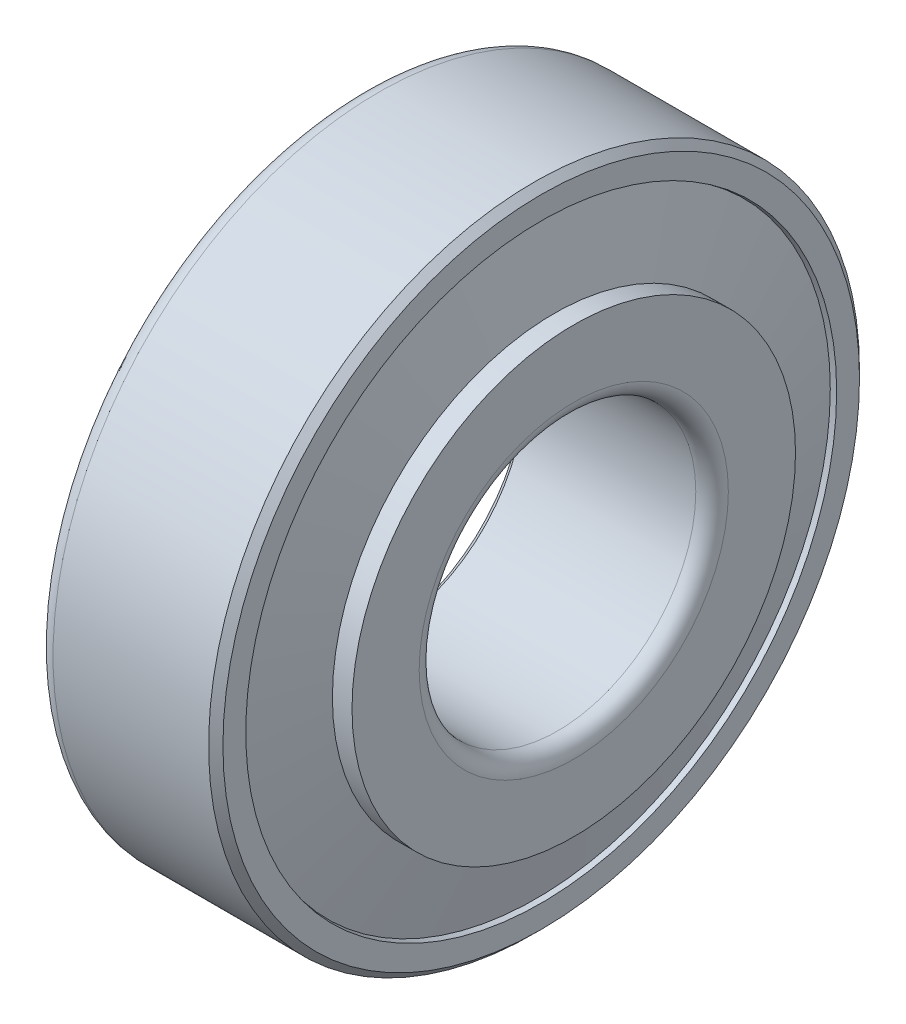
ISO-10303-21;
HEADER;
FILE_DESCRIPTION(('STEP AP214'),'2;1');
FILE_NAME('part.step','',(''),(''),'','','');
FILE_SCHEMA(('AUTOMOTIVE_DESIGN { 1 0 10303 214 1 1 1 1 }'));
ENDSEC;
DATA;
#1=APPLICATION_CONTEXT('core data for automotive mechanical design processes');
#2=APPLICATION_PROTOCOL_DEFINITION('international standard','automotive_design',2000,#1);
#3=PRODUCT_CONTEXT('',#1,'mechanical');
#4=PRODUCT('Part','Part','',(#3));
#5=PRODUCT_RELATED_PRODUCT_CATEGORY('part','',(#4));
#6=PRODUCT_DEFINITION_FORMATION('','',#4);
#7=PRODUCT_DEFINITION_CONTEXT('part definition',#1,'design');
#8=PRODUCT_DEFINITION('design','',#6,#7);
#9=PRODUCT_DEFINITION_SHAPE('','',#8);
#10=(LENGTH_UNIT() NAMED_UNIT(*) SI_UNIT(.MILLI.,.METRE.));
#11=(NAMED_UNIT(*) PLANE_ANGLE_UNIT() SI_UNIT($,.RADIAN.));
#12=(NAMED_UNIT(*) SI_UNIT($,.STERADIAN.) SOLID_ANGLE_UNIT());
#13=UNCERTAINTY_MEASURE_WITH_UNIT(LENGTH_MEASURE(1.E-05),#10,'distance_accuracy_value','');
#14=(GEOMETRIC_REPRESENTATION_CONTEXT(3) GLOBAL_UNCERTAINTY_ASSIGNED_CONTEXT((#13)) GLOBAL_UNIT_ASSIGNED_CONTEXT((#10,
#11,#12)) REPRESENTATION_CONTEXT('',''));
#15=CARTESIAN_POINT('',(0.,0.,0.));
#16=DIRECTION('',(0.,0.,1.));
#17=DIRECTION('',(1.,0.,0.));
#18=AXIS2_PLACEMENT_3D('',#15,#16,#17);
#19=CARTESIAN_POINT('',(-13.,0.,0.));
#20=DIRECTION('',(1.,0.,0.));
#21=DIRECTION('',(0.,0.,-1.));
#22=AXIS2_PLACEMENT_3D('',#19,#20,#21);
#23=CONICAL_SURFACE('',#22,15.704,0.219387886975681);
#24=CARTESIAN_POINT('',(-11.9830842954392,0.,0.));
#25=DIRECTION('',(-1.,0.,0.));
#26=DIRECTION('',(0.,0.,1.));
#27=AXIS2_PLACEMENT_3D('',#24,#25,#26);
#28=CIRCLE('',#27,15.9307485967285);
#29=CARTESIAN_POINT('',(-11.9830842954392,0.,15.9307485967285));
#30=VERTEX_POINT('',#29);
#31=EDGE_CURVE('E42',#30,#30,#28,.T.);
#32=ORIENTED_EDGE('',*,*,#31,.F.);
#33=EDGE_LOOP('',(#32));
#34=FACE_BOUND('',#33,.T.);
#35=CARTESIAN_POINT('',(-13.,0.,0.));
#36=DIRECTION('',(1.,0.,0.));
#37=DIRECTION('',(0.,0.,-1.));
#38=AXIS2_PLACEMENT_3D('',#35,#36,#37);
#39=CIRCLE('',#38,15.704);
#40=CARTESIAN_POINT('',(-13.,0.,-15.704));
#41=VERTEX_POINT('',#40);
#42=EDGE_CURVE('E54',#41,#41,#39,.T.);
#43=ORIENTED_EDGE('',*,*,#42,.F.);
#44=EDGE_LOOP('',(#43));
#45=FACE_BOUND('',#44,.T.);
#46=ADVANCED_FACE('F31',(#34,#45),#23,.F.);
#47=CARTESIAN_POINT('',(-2.,19.56,0.));
#48=DIRECTION('',(1.,0.,0.));
#49=DIRECTION('',(0.,0.,-1.));
#50=AXIS2_PLACEMENT_3D('',#47,#48,#49);
#51=PLANE('',#50);
#52=CARTESIAN_POINT('',(-2.,0.,0.));
#53=DIRECTION('',(1.,0.,0.));
#54=DIRECTION('',(0.,0.,-1.));
#55=AXIS2_PLACEMENT_3D('',#52,#53,#54);
#56=CIRCLE('',#55,19.56);
#57=CARTESIAN_POINT('',(-2.,0.,-19.56));
#58=VERTEX_POINT('',#57);
#59=EDGE_CURVE('E66',#58,#58,#56,.T.);
#60=ORIENTED_EDGE('',*,*,#59,.T.);
#61=EDGE_LOOP('',(#60));
#62=FACE_BOUND('',#61,.T.);
#63=CARTESIAN_POINT('',(-2.,0.,0.));
#64=DIRECTION('',(1.,0.,0.));
#65=DIRECTION('',(0.,0.,-1.));
#66=AXIS2_PLACEMENT_3D('',#63,#64,#65);
#67=CIRCLE('',#66,18.1567446599821);
#68=CARTESIAN_POINT('',(-2.,0.,-18.1567446599821));
#69=VERTEX_POINT('',#68);
#70=EDGE_CURVE('E51',#69,#69,#67,.T.);
#71=ORIENTED_EDGE('',*,*,#70,.F.);
#72=EDGE_LOOP('',(#71));
#73=FACE_BOUND('',#72,.T.);
#74=ADVANCED_FACE('F33',(#62,#73),#51,.T.);
#75=CARTESIAN_POINT('',(-2.32037890329752,0.,0.));
#76=DIRECTION('',(-1.,0.,0.));
#77=DIRECTION('',(0.,0.,1.));
#78=AXIS2_PLACEMENT_3D('',#75,#76,#77);
#79=CIRCLE('',#78,18.0853076014154);
#80=CARTESIAN_POINT('',(-2.32037890329752,0.,18.0853076014154));
#81=VERTEX_POINT('',#80);
#82=EDGE_CURVE('E46',#81,#81,#79,.F.);
#83=ORIENTED_EDGE('',*,*,#82,.F.);
#84=EDGE_LOOP('',(#83));
#85=FACE_BOUND('',#84,.T.);
#86=ORIENTED_EDGE('',*,*,#70,.T.);
#87=EDGE_LOOP('',(#86));
#88=FACE_BOUND('',#87,.T.);
#89=ADVANCED_FACE('F119',(#85,#88),#23,.F.);
#90=CARTESIAN_POINT('',(-13.,15.704,0.));
#91=DIRECTION('',(-1.,0.,0.));
#92=DIRECTION('',(0.,0.,1.));
#93=AXIS2_PLACEMENT_3D('',#90,#91,#92);
#94=PLANE('',#93);
#95=ORIENTED_EDGE('',*,*,#42,.T.);
#96=EDGE_LOOP('',(#95));
#97=FACE_BOUND('',#96,.T.);
#98=CARTESIAN_POINT('',(-13.,0.,0.));
#99=DIRECTION('',(1.,0.,0.));
#100=DIRECTION('',(0.,0.,-1.));
#101=AXIS2_PLACEMENT_3D('',#98,#99,#100);
#102=CIRCLE('',#101,19.);
#103=CARTESIAN_POINT('',(-13.,0.,-19.));
#104=VERTEX_POINT('',#103);
#105=EDGE_CURVE('E57',#104,#104,#102,.T.);
#106=ORIENTED_EDGE('',*,*,#105,.F.);
#107=EDGE_LOOP('',(#106));
#108=FACE_BOUND('',#107,.T.);
#109=ADVANCED_FACE('F128',(#97,#108),#94,.T.);
#110=CARTESIAN_POINT('',(-12.,0.,0.));
#111=DIRECTION('',(1.,0.,0.));
#112=DIRECTION('',(0.,0.,-1.));
#113=AXIS2_PLACEMENT_3D('',#110,#111,#112);
#114=TOROIDAL_SURFACE('',#113,19.,0.999999999999999);
#115=ORIENTED_EDGE('',*,*,#105,.T.);
#116=EDGE_LOOP('',(#115));
#117=FACE_BOUND('',#116,.T.);
#118=CARTESIAN_POINT('',(-12.,0.,0.));
#119=DIRECTION('',(1.,0.,0.));
#120=DIRECTION('',(0.,0.,-1.));
#121=AXIS2_PLACEMENT_3D('',#118,#119,#120);
#122=CIRCLE('',#121,20.);
#123=CARTESIAN_POINT('',(-12.,0.,-20.));
#124=VERTEX_POINT('',#123);
#125=EDGE_CURVE('E60',#124,#124,#122,.T.);
#126=ORIENTED_EDGE('',*,*,#125,.F.);
#127=EDGE_LOOP('',(#126));
#128=FACE_BOUND('',#127,.T.);
#129=ADVANCED_FACE('F133',(#117,#128),#114,.T.);
#130=CARTESIAN_POINT('',(-42.5,0.,0.));
#131=DIRECTION('',(1.,0.,0.));
#132=DIRECTION('',(0.,0.,-1.));
#133=AXIS2_PLACEMENT_3D('',#130,#131,#132);
#134=CYLINDRICAL_SURFACE('',#133,20.);
#135=ORIENTED_EDGE('',*,*,#125,.T.);
#136=EDGE_LOOP('',(#135));
#137=FACE_BOUND('',#136,.T.);
#138=CARTESIAN_POINT('',(-2.44,0.,0.));
#139=DIRECTION('',(1.,0.,0.));
#140=DIRECTION('',(0.,0.,-1.));
#141=AXIS2_PLACEMENT_3D('',#138,#139,#140);
#142=CIRCLE('',#141,20.);
#143=CARTESIAN_POINT('',(-2.44,0.,-20.));
#144=VERTEX_POINT('',#143);
#145=EDGE_CURVE('E63',#144,#144,#142,.T.);
#146=ORIENTED_EDGE('',*,*,#145,.F.);
#147=EDGE_LOOP('',(#146));
#148=FACE_BOUND('',#147,.T.);
#149=ADVANCED_FACE('F155',(#137,#148),#134,.T.);
#150=CARTESIAN_POINT('',(-2.,0.,0.));
#151=DIRECTION('',(-1.,0.,0.));
#152=DIRECTION('',(0.,0.,1.));
#153=AXIS2_PLACEMENT_3D('',#150,#151,#152);
#154=CONICAL_SURFACE('',#153,19.56,0.785398163397445);
#155=ORIENTED_EDGE('',*,*,#145,.T.);
#156=EDGE_LOOP('',(#155));
#157=FACE_BOUND('',#156,.T.);
#158=ORIENTED_EDGE('',*,*,#59,.F.);
#159=EDGE_LOOP('',(#158));
#160=FACE_BOUND('',#159,.T.);
#161=ADVANCED_FACE('F149',(#157,#160),#154,.T.);
#162=CARTESIAN_POINT('',(-12.,0.,0.));
#163=DIRECTION('',(-1.,0.,0.));
#164=DIRECTION('',(0.,0.,1.));
#165=AXIS2_PLACEMENT_3D('',#162,#163,#164);
#166=CONICAL_SURFACE('',#165,16.006611670943,1.35140843981922);
#167=CARTESIAN_POINT('',(-10.9314484911935,0.,0.));
#168=DIRECTION('',(-1.,0.,0.));
#169=DIRECTION('',(0.,0.,1.));
#170=AXIS2_PLACEMENT_3D('',#167,#168,#169);
#171=CIRCLE('',#170,11.2144020338594);
#172=CARTESIAN_POINT('',(-10.9314484911935,0.,11.2144020338594));
#173=VERTEX_POINT('',#172);
#174=EDGE_CURVE('E10',#173,#173,#171,.T.);
#175=ORIENTED_EDGE('',*,*,#174,.F.);
#176=EDGE_LOOP('',(#175));
#177=FACE_BOUND('',#176,.T.);
#178=ORIENTED_EDGE('',*,*,#31,.T.);
#179=EDGE_LOOP('',(#178));
#180=FACE_BOUND('',#179,.T.);
#181=ADVANCED_FACE('F143',(#177,#180),#166,.F.);
#182=CARTESIAN_POINT('',(-10.8737532475501,0.,0.));
#183=DIRECTION('',(1.,0.,0.));
#184=DIRECTION('',(0.,0.,-1.));
#185=AXIS2_PLACEMENT_3D('',#182,#183,#184);
#186=CONICAL_SURFACE('',#185,10.9556520341417,0.219387886975681);
#187=CARTESIAN_POINT('',(-10.8683887316016,0.,0.));
#188=DIRECTION('',(-1.,0.,0.));
#189=DIRECTION('',(0.,0.,1.));
#190=AXIS2_PLACEMENT_3D('',#187,#188,#189);
#191=CIRCLE('',#190,10.9568481966732);
#192=CARTESIAN_POINT('',(-10.8683887316016,0.,10.9568481966732));
#193=VERTEX_POINT('',#192);
#194=EDGE_CURVE('E38',#193,#193,#191,.F.);
#195=ORIENTED_EDGE('',*,*,#194,.F.);
#196=EDGE_LOOP('',(#195));
#197=FACE_BOUND('',#196,.T.);
#198=CARTESIAN_POINT('',(-1.21104785540842,0.,0.));
#199=DIRECTION('',(1.,0.,0.));
#200=DIRECTION('',(0.,0.,-1.));
#201=AXIS2_PLACEMENT_3D('',#198,#199,#200);
#202=CIRCLE('',#201,13.1102110388286);
#203=CARTESIAN_POINT('',(-1.21104785540842,0.,-13.1102110388286));
#204=VERTEX_POINT('',#203);
#205=EDGE_CURVE('E69',#204,#204,#202,.T.);
#206=ORIENTED_EDGE('',*,*,#205,.T.);
#207=EDGE_LOOP('',(#206));
#208=FACE_BOUND('',#207,.T.);
#209=ADVANCED_FACE('F114',(#197,#208),#186,.F.);
#210=CARTESIAN_POINT('',(-1.21104785540842,0.,0.));
#211=DIRECTION('',(-1.,0.,0.));
#212=DIRECTION('',(0.,0.,1.));
#213=AXIS2_PLACEMENT_3D('',#210,#211,#212);
#214=CONICAL_SURFACE('',#213,13.1102110388286,1.35140843981922);
#215=ORIENTED_EDGE('',*,*,#82,.T.);
#216=EDGE_LOOP('',(#215));
#217=FACE_BOUND('',#216,.T.);
#218=ORIENTED_EDGE('',*,*,#205,.F.);
#219=EDGE_LOOP('',(#218));
#220=FACE_BOUND('',#219,.T.);
#221=ADVANCED_FACE('F106',(#217,#220),#214,.T.);
#222=CARTESIAN_POINT('',(-10.8681220150603,0.,0.));
#223=DIRECTION('',(-1.,0.,0.));
#224=DIRECTION('',(0.,0.,1.));
#225=AXIS2_PLACEMENT_3D('',#222,#223,#224);
#226=CONICAL_SURFACE('',#225,10.9556520338594,1.35140843981921);
#227=ORIENTED_EDGE('',*,*,#194,.T.);
#228=EDGE_LOOP('',(#227));
#229=FACE_BOUND('',#228,.T.);
#230=CARTESIAN_POINT('',(-10.8681220150603,0.,0.));
#231=DIRECTION('',(1.,0.,0.));
#232=DIRECTION('',(0.,0.,-1.));
#233=AXIS2_PLACEMENT_3D('',#230,#231,#232);
#234=CIRCLE('',#233,10.9556520338594);
#235=CARTESIAN_POINT('',(-10.8681220150603,0.,-10.9556520338594));
#236=VERTEX_POINT('',#235);
#237=EDGE_CURVE('E96',#236,#236,#234,.T.);
#238=ORIENTED_EDGE('',*,*,#237,.F.);
#239=EDGE_LOOP('',(#238));
#240=FACE_BOUND('',#239,.T.);
#241=ADVANCED_FACE('F103',(#229,#240),#226,.T.);
#242=CARTESIAN_POINT('',(-42.5,0.,0.));
#243=DIRECTION('',(1.,0.,0.));
#244=DIRECTION('',(0.,0.,-1.));
#245=AXIS2_PLACEMENT_3D('',#242,#243,#244);
#246=CYLINDRICAL_SURFACE('',#245,11.2144020338594);
#247=ORIENTED_EDGE('',*,*,#174,.T.);
#248=EDGE_LOOP('',(#247));
#249=FACE_BOUND('',#248,.T.);
#250=CARTESIAN_POINT('',(-12.,0.,0.));
#251=DIRECTION('',(1.,0.,0.));
#252=DIRECTION('',(0.,0.,-1.));
#253=AXIS2_PLACEMENT_3D('',#250,#251,#252);
#254=CIRCLE('',#253,11.2144020338594);
#255=CARTESIAN_POINT('',(-12.,0.,-11.2144020338594));
#256=VERTEX_POINT('',#255);
#257=EDGE_CURVE('E72',#256,#256,#254,.T.);
#258=ORIENTED_EDGE('',*,*,#257,.T.);
#259=EDGE_LOOP('',(#258));
#260=FACE_BOUND('',#259,.T.);
#261=ADVANCED_FACE('F105',(#249,#260),#246,.T.);
#262=CARTESIAN_POINT('',(-12.,11.2144020338594,0.));
#263=DIRECTION('',(-1.,0.,0.));
#264=DIRECTION('',(0.,0.,1.));
#265=AXIS2_PLACEMENT_3D('',#262,#263,#264);
#266=PLANE('',#265);
#267=CARTESIAN_POINT('',(-12.,0.,0.));
#268=DIRECTION('',(1.,0.,0.));
#269=DIRECTION('',(0.,0.,-1.));
#270=AXIS2_PLACEMENT_3D('',#267,#268,#269);
#271=CIRCLE('',#270,8.94);
#272=CARTESIAN_POINT('',(-12.,0.,-8.94));
#273=VERTEX_POINT('',#272);
#274=EDGE_CURVE('E75',#273,#273,#271,.T.);
#275=ORIENTED_EDGE('',*,*,#274,.T.);
#276=EDGE_LOOP('',(#275));
#277=FACE_BOUND('',#276,.T.);
#278=ORIENTED_EDGE('',*,*,#257,.F.);
#279=EDGE_LOOP('',(#278));
#280=FACE_BOUND('',#279,.T.);
#281=ADVANCED_FACE('F112',(#277,#280),#266,.T.);
#282=CARTESIAN_POINT('',(-12.,0.,0.));
#283=DIRECTION('',(-1.,0.,0.));
#284=DIRECTION('',(0.,0.,1.));
#285=AXIS2_PLACEMENT_3D('',#282,#283,#284);
#286=CONICAL_SURFACE('',#285,8.94,0.785398163397446);
#287=CARTESIAN_POINT('',(-11.56,0.,0.));
#288=DIRECTION('',(1.,0.,0.));
#289=DIRECTION('',(0.,0.,-1.));
#290=AXIS2_PLACEMENT_3D('',#287,#288,#289);
#291=CIRCLE('',#290,8.5);
#292=CARTESIAN_POINT('',(-11.56,0.,-8.5));
#293=VERTEX_POINT('',#292);
#294=EDGE_CURVE('E78',#293,#293,#291,.T.);
#295=ORIENTED_EDGE('',*,*,#294,.T.);
#296=EDGE_LOOP('',(#295));
#297=FACE_BOUND('',#296,.T.);
#298=ORIENTED_EDGE('',*,*,#274,.F.);
#299=EDGE_LOOP('',(#298));
#300=FACE_BOUND('',#299,.T.);
#301=ADVANCED_FACE('F213',(#297,#300),#286,.F.);
#302=CARTESIAN_POINT('',(-42.5,0.,0.));
#303=DIRECTION('',(1.,0.,0.));
#304=DIRECTION('',(0.,0.,-1.));
#305=AXIS2_PLACEMENT_3D('',#302,#303,#304);
#306=CYLINDRICAL_SURFACE('',#305,8.5);
#307=CARTESIAN_POINT('',(-1.,0.,0.));
#308=DIRECTION('',(1.,0.,0.));
#309=DIRECTION('',(0.,0.,-1.));
#310=AXIS2_PLACEMENT_3D('',#307,#308,#309);
#311=CIRCLE('',#310,8.5);
#312=CARTESIAN_POINT('',(-1.,0.,-8.5));
#313=VERTEX_POINT('',#312);
#314=EDGE_CURVE('E81',#313,#313,#311,.T.);
#315=ORIENTED_EDGE('',*,*,#314,.T.);
#316=EDGE_LOOP('',(#315));
#317=FACE_BOUND('',#316,.T.);
#318=ORIENTED_EDGE('',*,*,#294,.F.);
#319=EDGE_LOOP('',(#318));
#320=FACE_BOUND('',#319,.T.);
#321=ADVANCED_FACE('F223',(#317,#320),#306,.F.);
#322=CARTESIAN_POINT('',(-1.,0.,0.));
#323=DIRECTION('',(1.,0.,0.));
#324=DIRECTION('',(0.,0.,-1.));
#325=AXIS2_PLACEMENT_3D('',#322,#323,#324);
#326=TOROIDAL_SURFACE('',#325,9.5,1.);
#327=CARTESIAN_POINT('',(0.,0.,0.));
#328=DIRECTION('',(1.,0.,0.));
#329=DIRECTION('',(0.,0.,-1.));
#330=AXIS2_PLACEMENT_3D('',#327,#328,#329);
#331=CIRCLE('',#330,9.5);
#332=CARTESIAN_POINT('',(0.,0.,-9.5));
#333=VERTEX_POINT('',#332);
#334=EDGE_CURVE('E84',#333,#333,#331,.T.);
#335=ORIENTED_EDGE('',*,*,#334,.T.);
#336=EDGE_LOOP('',(#335));
#337=FACE_BOUND('',#336,.T.);
#338=ORIENTED_EDGE('',*,*,#314,.F.);
#339=EDGE_LOOP('',(#338));
#340=FACE_BOUND('',#339,.T.);
#341=ADVANCED_FACE('F233',(#337,#340),#326,.T.);
#342=CARTESIAN_POINT('',(0.,9.5,0.));
#343=DIRECTION('',(1.,0.,0.));
#344=DIRECTION('',(0.,0.,-1.));
#345=AXIS2_PLACEMENT_3D('',#342,#343,#344);
#346=PLANE('',#345);
#347=CARTESIAN_POINT('',(0.,0.,0.));
#348=DIRECTION('',(1.,0.,0.));
#349=DIRECTION('',(0.,0.,-1.));
#350=AXIS2_PLACEMENT_3D('',#347,#348,#349);
#351=CIRCLE('',#350,13.6277110385462);
#352=CARTESIAN_POINT('',(0.,0.,-13.6277110385462));
#353=VERTEX_POINT('',#352);
#354=EDGE_CURVE('E87',#353,#353,#351,.T.);
#355=ORIENTED_EDGE('',*,*,#354,.T.);
#356=EDGE_LOOP('',(#355));
#357=FACE_BOUND('',#356,.T.);
#358=ORIENTED_EDGE('',*,*,#334,.F.);
#359=EDGE_LOOP('',(#358));
#360=FACE_BOUND('',#359,.T.);
#361=ADVANCED_FACE('F243',(#357,#360),#346,.T.);
#362=CARTESIAN_POINT('',(-42.5,0.,0.));
#363=DIRECTION('',(1.,0.,0.));
#364=DIRECTION('',(0.,0.,-1.));
#365=AXIS2_PLACEMENT_3D('',#362,#363,#364);
#366=CYLINDRICAL_SURFACE('',#365,13.6277110385462);
#367=CARTESIAN_POINT('',(-1.20541662291868,0.,0.));
#368=DIRECTION('',(1.,0.,0.));
#369=DIRECTION('',(0.,0.,-1.));
#370=AXIS2_PLACEMENT_3D('',#367,#368,#369);
#371=CIRCLE('',#370,13.6277110385462);
#372=CARTESIAN_POINT('',(-1.20541662291868,0.,-13.6277110385462));
#373=VERTEX_POINT('',#372);
#374=EDGE_CURVE('E90',#373,#373,#371,.T.);
#375=ORIENTED_EDGE('',*,*,#374,.T.);
#376=EDGE_LOOP('',(#375));
#377=FACE_BOUND('',#376,.T.);
#378=ORIENTED_EDGE('',*,*,#354,.F.);
#379=EDGE_LOOP('',(#378));
#380=FACE_BOUND('',#379,.T.);
#381=ADVANCED_FACE('F253',(#377,#380),#366,.T.);
#382=CARTESIAN_POINT('',(-1.20541662291868,13.6277110385462,0.));
#383=DIRECTION('',(-1.,0.,0.));
#384=DIRECTION('',(0.,0.,1.));
#385=AXIS2_PLACEMENT_3D('',#382,#383,#384);
#386=PLANE('',#385);
#387=CARTESIAN_POINT('',(-1.20541662291868,0.,0.));
#388=DIRECTION('',(1.,0.,0.));
#389=DIRECTION('',(0.,0.,-1.));
#390=AXIS2_PLACEMENT_3D('',#387,#388,#389);
#391=CIRCLE('',#390,13.1102110385462);
#392=CARTESIAN_POINT('',(-1.20541662291868,0.,-13.1102110385462));
#393=VERTEX_POINT('',#392);
#394=EDGE_CURVE('E93',#393,#393,#391,.T.);
#395=ORIENTED_EDGE('',*,*,#394,.T.);
#396=EDGE_LOOP('',(#395));
#397=FACE_BOUND('',#396,.T.);
#398=ORIENTED_EDGE('',*,*,#374,.F.);
#399=EDGE_LOOP('',(#398));
#400=FACE_BOUND('',#399,.T.);
#401=ADVANCED_FACE('F263',(#397,#400),#386,.T.);
#402=CARTESIAN_POINT('',(-1.20541662291868,0.,0.));
#403=DIRECTION('',(1.,0.,0.));
#404=DIRECTION('',(0.,0.,-1.));
#405=AXIS2_PLACEMENT_3D('',#402,#403,#404);
#406=CONICAL_SURFACE('',#405,13.1102110385462,0.219387886975681);
#407=ORIENTED_EDGE('',*,*,#237,.T.);
#408=EDGE_LOOP('',(#407));
#409=FACE_BOUND('',#408,.T.);
#410=ORIENTED_EDGE('',*,*,#394,.F.);
#411=EDGE_LOOP('',(#410));
#412=FACE_BOUND('',#411,.T.);
#413=ADVANCED_FACE('F100',(#409,#412),#406,.T.);
#414=CLOSED_SHELL('',(#46,#74,#89,#109,#129,#149,#161,#181,#209,#221,#241,#261,#281,#301,#321,
#341,#361,#381,#401,#413));
#415=MANIFOLD_SOLID_BREP('B2',#414);
#416=ADVANCED_BREP_SHAPE_REPRESENTATION('',(#18,#415),#14);
#417=SHAPE_DEFINITION_REPRESENTATION(#9,#416);
ENDSEC;
END-ISO-10303-21;
